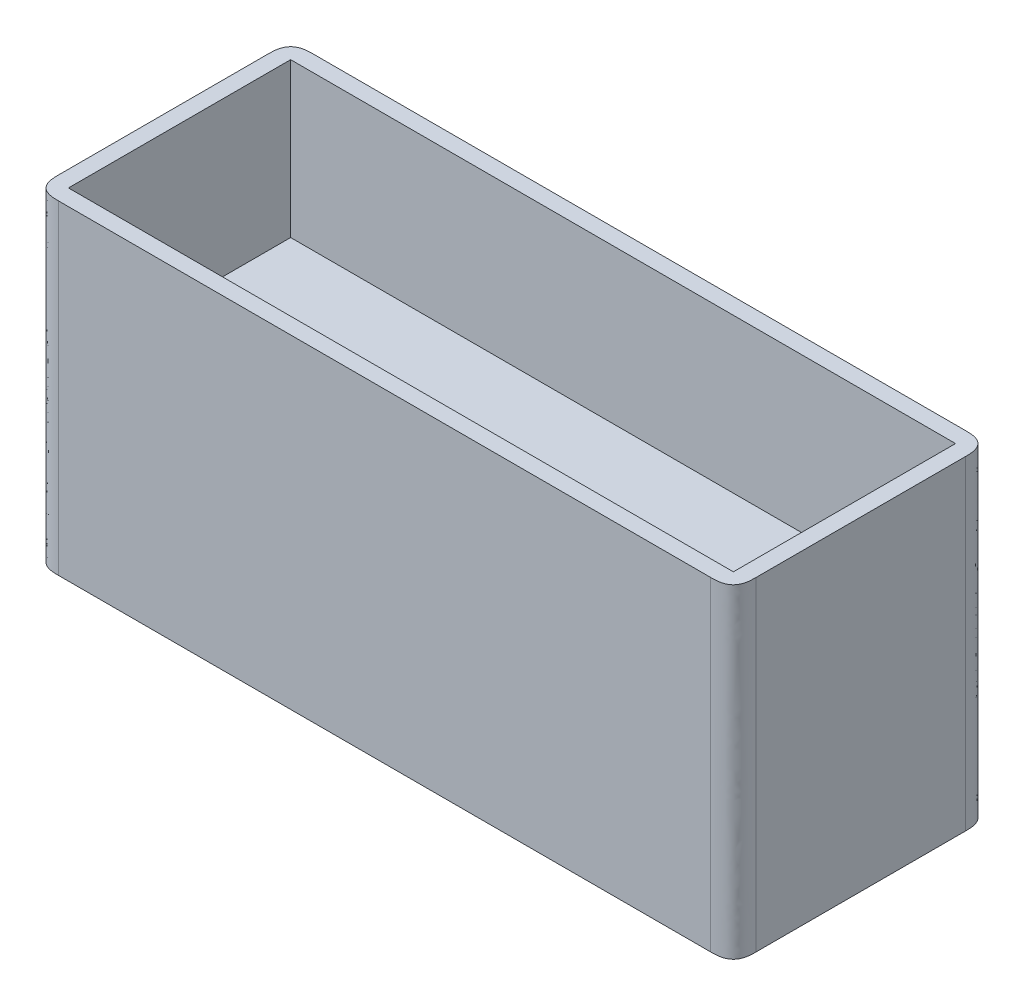
ISO-10303-21;
HEADER;
FILE_DESCRIPTION(('STEP AP214'),'2;1');
FILE_NAME('part.step','',(''),(''),'','','');
FILE_SCHEMA(('AUTOMOTIVE_DESIGN { 1 0 10303 214 1 1 1 1 }'));
ENDSEC;
DATA;
#1=APPLICATION_CONTEXT('core data for automotive mechanical design processes');
#2=APPLICATION_PROTOCOL_DEFINITION('international standard','automotive_design',2000,#1);
#3=PRODUCT_CONTEXT('',#1,'mechanical');
#4=PRODUCT('Part','Part','',(#3));
#5=PRODUCT_RELATED_PRODUCT_CATEGORY('part','',(#4));
#6=PRODUCT_DEFINITION_FORMATION('','',#4);
#7=PRODUCT_DEFINITION_CONTEXT('part definition',#1,'design');
#8=PRODUCT_DEFINITION('design','',#6,#7);
#9=PRODUCT_DEFINITION_SHAPE('','',#8);
#10=(LENGTH_UNIT() NAMED_UNIT(*) SI_UNIT(.MILLI.,.METRE.));
#11=(NAMED_UNIT(*) PLANE_ANGLE_UNIT() SI_UNIT($,.RADIAN.));
#12=(NAMED_UNIT(*) SI_UNIT($,.STERADIAN.) SOLID_ANGLE_UNIT());
#13=UNCERTAINTY_MEASURE_WITH_UNIT(LENGTH_MEASURE(1.E-05),#10,'distance_accuracy_value','');
#14=(GEOMETRIC_REPRESENTATION_CONTEXT(3) GLOBAL_UNCERTAINTY_ASSIGNED_CONTEXT((#13)) GLOBAL_UNIT_ASSIGNED_CONTEXT((#10,
#11,#12)) REPRESENTATION_CONTEXT('',''));
#15=CARTESIAN_POINT('',(0.,0.,0.));
#16=DIRECTION('',(0.,0.,1.));
#17=DIRECTION('',(1.,0.,0.));
#18=AXIS2_PLACEMENT_3D('',#15,#16,#17);
#19=CARTESIAN_POINT('',(102.5,50.,-34.25));
#20=DIRECTION('',(-1.,0.,0.));
#21=DIRECTION('',(0.,0.,1.));
#22=AXIS2_PLACEMENT_3D('',#19,#20,#21);
#23=PLANE('',#22);
#24=DIRECTION('',(0.,-1.,0.));
#25=VECTOR('',#24,1.);
#26=CARTESIAN_POINT('',(102.5,50.,34.25));
#27=LINE('',#26,#25);
#28=CARTESIAN_POINT('',(102.5,-2.5,34.25));
#29=VERTEX_POINT('',#28);
#30=CARTESIAN_POINT('',(102.5,-50.,34.25));
#31=VERTEX_POINT('',#30);
#32=EDGE_CURVE('E169',#29,#31,#27,.T.);
#33=ORIENTED_EDGE('',*,*,#32,.F.);
#34=DIRECTION('',(0.,0.,1.));
#35=VECTOR('',#34,1.);
#36=CARTESIAN_POINT('',(102.5,-2.5,0.));
#37=LINE('',#36,#35);
#38=CARTESIAN_POINT('',(102.5,-2.5,-34.25));
#39=VERTEX_POINT('',#38);
#40=EDGE_CURVE('E193',#39,#29,#37,.T.);
#41=ORIENTED_EDGE('',*,*,#40,.F.);
#42=DIRECTION('',(0.,-1.,0.));
#43=VECTOR('',#42,1.);
#44=CARTESIAN_POINT('',(102.5,50.,-34.25));
#45=LINE('',#44,#43);
#46=CARTESIAN_POINT('',(102.5,-50.,-34.25));
#47=VERTEX_POINT('',#46);
#48=EDGE_CURVE('E224',#39,#47,#45,.T.);
#49=ORIENTED_EDGE('',*,*,#48,.T.);
#50=DIRECTION('',(0.,0.,-1.));
#51=VECTOR('',#50,1.);
#52=CARTESIAN_POINT('',(102.5,-50.,-34.25));
#53=LINE('',#52,#51);
#54=EDGE_CURVE('E185',#31,#47,#53,.T.);
#55=ORIENTED_EDGE('',*,*,#54,.F.);
#56=EDGE_LOOP('',(#33,#41,#49,#55));
#57=FACE_BOUND('',#56,.T.);
#58=ADVANCED_FACE('F37',(#57),#23,.T.);
#59=CARTESIAN_POINT('',(-102.5,50.,-34.25));
#60=DIRECTION('',(0.,0.,1.));
#61=DIRECTION('',(1.,0.,0.));
#62=AXIS2_PLACEMENT_3D('',#59,#60,#61);
#63=PLANE('',#62);
#64=ORIENTED_EDGE('',*,*,#48,.F.);
#65=DIRECTION('',(1.,0.,0.));
#66=VECTOR('',#65,1.);
#67=CARTESIAN_POINT('',(0.,-2.5,-34.25));
#68=LINE('',#67,#66);
#69=CARTESIAN_POINT('',(-102.5,-2.5,-34.25));
#70=VERTEX_POINT('',#69);
#71=EDGE_CURVE('E195',#70,#39,#68,.T.);
#72=ORIENTED_EDGE('',*,*,#71,.F.);
#73=DIRECTION('',(0.,-1.,0.));
#74=VECTOR('',#73,1.);
#75=CARTESIAN_POINT('',(-102.5,50.,-34.25));
#76=LINE('',#75,#74);
#77=CARTESIAN_POINT('',(-102.5,-50.,-34.25));
#78=VERTEX_POINT('',#77);
#79=EDGE_CURVE('E220',#70,#78,#76,.T.);
#80=ORIENTED_EDGE('',*,*,#79,.T.);
#81=DIRECTION('',(-1.,0.,0.));
#82=VECTOR('',#81,1.);
#83=CARTESIAN_POINT('',(-102.5,-50.,-34.25));
#84=LINE('',#83,#82);
#85=EDGE_CURVE('E188',#47,#78,#84,.T.);
#86=ORIENTED_EDGE('',*,*,#85,.F.);
#87=EDGE_LOOP('',(#64,#72,#80,#86));
#88=FACE_BOUND('',#87,.T.);
#89=ADVANCED_FACE('F621',(#88),#63,.T.);
#90=CARTESIAN_POINT('',(-102.5,50.,-34.25));
#91=DIRECTION('',(1.,0.,0.));
#92=DIRECTION('',(0.,0.,-1.));
#93=AXIS2_PLACEMENT_3D('',#90,#91,#92);
#94=PLANE('',#93);
#95=ORIENTED_EDGE('',*,*,#79,.F.);
#96=DIRECTION('',(0.,0.,1.));
#97=VECTOR('',#96,1.);
#98=CARTESIAN_POINT('',(-102.5,-2.5,0.));
#99=LINE('',#98,#97);
#100=CARTESIAN_POINT('',(-102.5,-2.5,34.25));
#101=VERTEX_POINT('',#100);
#102=EDGE_CURVE('E197',#70,#101,#99,.T.);
#103=ORIENTED_EDGE('',*,*,#102,.T.);
#104=DIRECTION('',(0.,-1.,0.));
#105=VECTOR('',#104,1.);
#106=CARTESIAN_POINT('',(-102.5,50.,34.25));
#107=LINE('',#106,#105);
#108=CARTESIAN_POINT('',(-102.5,-50.,34.25));
#109=VERTEX_POINT('',#108);
#110=EDGE_CURVE('E168',#101,#109,#107,.T.);
#111=ORIENTED_EDGE('',*,*,#110,.T.);
#112=DIRECTION('',(0.,0.,1.));
#113=VECTOR('',#112,1.);
#114=CARTESIAN_POINT('',(-102.5,-50.,-34.25));
#115=LINE('',#114,#113);
#116=EDGE_CURVE('E213',#78,#109,#115,.T.);
#117=ORIENTED_EDGE('',*,*,#116,.F.);
#118=EDGE_LOOP('',(#95,#103,#111,#117));
#119=FACE_BOUND('',#118,.T.);
#120=ADVANCED_FACE('F625',(#119),#94,.T.);
#121=CARTESIAN_POINT('',(-102.5,50.,34.25));
#122=DIRECTION('',(0.,0.,-1.));
#123=DIRECTION('',(-1.,0.,0.));
#124=AXIS2_PLACEMENT_3D('',#121,#122,#123);
#125=PLANE('',#124);
#126=ORIENTED_EDGE('',*,*,#110,.F.);
#127=DIRECTION('',(1.,0.,0.));
#128=VECTOR('',#127,1.);
#129=CARTESIAN_POINT('',(0.,-2.5,34.25));
#130=LINE('',#129,#128);
#131=EDGE_CURVE('E180',#101,#29,#130,.T.);
#132=ORIENTED_EDGE('',*,*,#131,.T.);
#133=ORIENTED_EDGE('',*,*,#32,.T.);
#134=DIRECTION('',(1.,0.,0.));
#135=VECTOR('',#134,1.);
#136=CARTESIAN_POINT('',(-102.5,-50.,34.25));
#137=LINE('',#136,#135);
#138=EDGE_CURVE('E205',#109,#31,#137,.T.);
#139=ORIENTED_EDGE('',*,*,#138,.F.);
#140=EDGE_LOOP('',(#126,#132,#133,#139));
#141=FACE_BOUND('',#140,.T.);
#142=ADVANCED_FACE('F628',(#141),#125,.T.);
#143=CARTESIAN_POINT('',(0.,50.,0.));
#144=DIRECTION('',(0.,1.,0.));
#145=DIRECTION('',(0.,0.,1.));
#146=AXIS2_PLACEMENT_3D('',#143,#144,#145);
#147=PLANE('',#146);
#148=DIRECTION('',(-1.,0.,0.));
#149=VECTOR('',#148,1.);
#150=CARTESIAN_POINT('',(-107.5,50.,-39.25));
#151=LINE('',#150,#149);
#152=CARTESIAN_POINT('',(100.5,50.,-39.25));
#153=VERTEX_POINT('',#152);
#154=CARTESIAN_POINT('',(-100.5,50.,-39.25));
#155=VERTEX_POINT('',#154);
#156=EDGE_CURVE('E340',#153,#155,#151,.T.);
#157=ORIENTED_EDGE('',*,*,#156,.T.);
#158=CARTESIAN_POINT('',(-107.5,50.,-32.25));
#159=CARTESIAN_POINT('',(-107.5,50.,-33.4273863607376));
#160=CARTESIAN_POINT('',(-107.5,50.,-34.6047727214753));
#161=CARTESIAN_POINT('',(-106.998156561147,50.,-37.1997474683058));
#162=CARTESIAN_POINT('',(-105.449747468306,50.,-38.7481565611474));
#163=CARTESIAN_POINT('',(-102.854772721475,50.,-39.25));
#164=CARTESIAN_POINT('',(-101.677386360738,50.,-39.25));
#165=CARTESIAN_POINT('',(-100.5,50.,-39.25));
#166=B_SPLINE_CURVE_WITH_KNOTS('',5,(#158,#159,#160,#161,#162,#163,#164,#165),.UNSPECIFIED.,.F.,
.F.,(6,2,6),(0.,0.5,1.),.UNSPECIFIED.);
#167=CARTESIAN_POINT('',(-107.5,50.,-32.25));
#168=VERTEX_POINT('',#167);
#169=EDGE_CURVE('E391',#155,#168,#166,.F.);
#170=ORIENTED_EDGE('',*,*,#169,.T.);
#171=DIRECTION('',(0.,0.,1.));
#172=VECTOR('',#171,1.);
#173=CARTESIAN_POINT('',(-107.5,50.,-39.25));
#174=LINE('',#173,#172);
#175=CARTESIAN_POINT('',(-107.5,50.,32.25));
#176=VERTEX_POINT('',#175);
#177=EDGE_CURVE('E232',#168,#176,#174,.T.);
#178=ORIENTED_EDGE('',*,*,#177,.T.);
#179=CARTESIAN_POINT('',(-100.5,50.,39.25));
#180=CARTESIAN_POINT('',(-101.677386360738,50.,39.25));
#181=CARTESIAN_POINT('',(-102.854772721475,50.,39.25));
#182=CARTESIAN_POINT('',(-105.449747468306,50.,38.7481565611474));
#183=CARTESIAN_POINT('',(-106.998156561147,50.,37.1997474683058));
#184=CARTESIAN_POINT('',(-107.5,50.,34.6047727214753));
#185=CARTESIAN_POINT('',(-107.5,50.,33.4273863607376));
#186=CARTESIAN_POINT('',(-107.5,50.,32.25));
#187=B_SPLINE_CURVE_WITH_KNOTS('',5,(#179,#180,#181,#182,#183,#184,#185,#186),.UNSPECIFIED.,.F.,
.F.,(6,2,6),(0.,0.5,1.),.UNSPECIFIED.);
#188=CARTESIAN_POINT('',(-100.5,50.,39.25));
#189=VERTEX_POINT('',#188);
#190=EDGE_CURVE('E379',#176,#189,#187,.F.);
#191=ORIENTED_EDGE('',*,*,#190,.T.);
#192=DIRECTION('',(1.,0.,0.));
#193=VECTOR('',#192,1.);
#194=CARTESIAN_POINT('',(-107.5,50.,39.25));
#195=LINE('',#194,#193);
#196=CARTESIAN_POINT('',(100.5,50.,39.25));
#197=VERTEX_POINT('',#196);
#198=EDGE_CURVE('E236',#189,#197,#195,.T.);
#199=ORIENTED_EDGE('',*,*,#198,.T.);
#200=CARTESIAN_POINT('',(107.5,50.,32.25));
#201=CARTESIAN_POINT('',(107.5,50.,33.4273863607376));
#202=CARTESIAN_POINT('',(107.5,50.,34.6047727214753));
#203=CARTESIAN_POINT('',(106.998156561147,50.,37.1997474683058));
#204=CARTESIAN_POINT('',(105.449747468306,50.,38.7481565611474));
#205=CARTESIAN_POINT('',(102.854772721475,50.,39.25));
#206=CARTESIAN_POINT('',(101.677386360738,50.,39.25));
#207=CARTESIAN_POINT('',(100.5,50.,39.25));
#208=B_SPLINE_CURVE_WITH_KNOTS('',5,(#200,#201,#202,#203,#204,#205,#206,#207),.UNSPECIFIED.,.F.,
.F.,(6,2,6),(0.,0.5,1.),.UNSPECIFIED.);
#209=CARTESIAN_POINT('',(107.5,50.,32.25));
#210=VERTEX_POINT('',#209);
#211=EDGE_CURVE('E65',#197,#210,#208,.F.);
#212=ORIENTED_EDGE('',*,*,#211,.T.);
#213=DIRECTION('',(0.,0.,-1.));
#214=VECTOR('',#213,1.);
#215=CARTESIAN_POINT('',(107.5,50.,-39.25));
#216=LINE('',#215,#214);
#217=CARTESIAN_POINT('',(107.5,50.,-32.25));
#218=VERTEX_POINT('',#217);
#219=EDGE_CURVE('E348',#210,#218,#216,.T.);
#220=ORIENTED_EDGE('',*,*,#219,.T.);
#221=CARTESIAN_POINT('',(100.5,49.9999999999817,-39.25));
#222=CARTESIAN_POINT('',(101.677386360738,49.9999999999817,-39.25));
#223=CARTESIAN_POINT('',(102.854772721475,49.9999999999817,-39.25));
#224=CARTESIAN_POINT('',(105.449747468306,50.0000000000291,-38.7481565611474));
#225=CARTESIAN_POINT('',(106.998156561147,50.0000000000291,-37.1997474683058));
#226=CARTESIAN_POINT('',(107.5,49.9999999999817,-34.6047727214752));
#227=CARTESIAN_POINT('',(107.5,49.9999999999817,-33.4273863607376));
#228=CARTESIAN_POINT('',(107.5,49.9999999999817,-32.25));
#229=B_SPLINE_CURVE_WITH_KNOTS('',5,(#221,#222,#223,#224,#225,#226,#227,#228),.UNSPECIFIED.,.F.,
.F.,(6,2,6),(0.,0.5,1.),.UNSPECIFIED.);
#230=EDGE_CURVE('E359',#218,#153,#229,.F.);
#231=ORIENTED_EDGE('',*,*,#230,.T.);
#232=EDGE_LOOP('',(#157,#170,#178,#191,#199,#212,#220,#231));
#233=FACE_BOUND('',#232,.T.);
#234=DIRECTION('',(-1.,0.,0.));
#235=VECTOR('',#234,1.);
#236=CARTESIAN_POINT('',(-102.5,50.,-34.25));
#237=LINE('',#236,#235);
#238=CARTESIAN_POINT('',(102.5,50.,-34.25));
#239=VERTEX_POINT('',#238);
#240=CARTESIAN_POINT('',(-102.5,50.,-34.25));
#241=VERTEX_POINT('',#240);
#242=EDGE_CURVE('E204',#239,#241,#237,.T.);
#243=ORIENTED_EDGE('',*,*,#242,.F.);
#244=DIRECTION('',(0.,0.,-1.));
#245=VECTOR('',#244,1.);
#246=CARTESIAN_POINT('',(102.5,50.,-34.25));
#247=LINE('',#246,#245);
#248=CARTESIAN_POINT('',(102.5,50.,34.25));
#249=VERTEX_POINT('',#248);
#250=EDGE_CURVE('E202',#249,#239,#247,.T.);
#251=ORIENTED_EDGE('',*,*,#250,.F.);
#252=DIRECTION('',(1.,0.,0.));
#253=VECTOR('',#252,1.);
#254=CARTESIAN_POINT('',(-102.5,50.,34.25));
#255=LINE('',#254,#253);
#256=CARTESIAN_POINT('',(-102.5,50.,34.25));
#257=VERTEX_POINT('',#256);
#258=EDGE_CURVE('E165',#257,#249,#255,.T.);
#259=ORIENTED_EDGE('',*,*,#258,.F.);
#260=DIRECTION('',(0.,0.,1.));
#261=VECTOR('',#260,1.);
#262=CARTESIAN_POINT('',(-102.5,50.,-34.25));
#263=LINE('',#262,#261);
#264=EDGE_CURVE('E207',#241,#257,#263,.T.);
#265=ORIENTED_EDGE('',*,*,#264,.F.);
#266=EDGE_LOOP('',(#243,#251,#259,#265));
#267=FACE_BOUND('',#266,.T.);
#268=ADVANCED_FACE('F314',(#233,#267),#147,.T.);
#269=CARTESIAN_POINT('',(0.,-50.,0.));
#270=DIRECTION('',(0.,1.,0.));
#271=DIRECTION('',(0.,0.,1.));
#272=AXIS2_PLACEMENT_3D('',#269,#270,#271);
#273=PLANE('',#272);
#274=DIRECTION('',(0.,0.,1.));
#275=VECTOR('',#274,1.);
#276=CARTESIAN_POINT('',(-107.5,-50.,-39.25));
#277=LINE('',#276,#275);
#278=CARTESIAN_POINT('',(-107.5,-50.,-32.25));
#279=VERTEX_POINT('',#278);
#280=CARTESIAN_POINT('',(-107.5,-50.,32.25));
#281=VERTEX_POINT('',#280);
#282=EDGE_CURVE('E226',#279,#281,#277,.T.);
#283=ORIENTED_EDGE('',*,*,#282,.F.);
#284=CARTESIAN_POINT('',(-100.5,-50.,-39.25));
#285=CARTESIAN_POINT('',(-101.677386360738,-50.,-39.25));
#286=CARTESIAN_POINT('',(-102.854772721475,-50.,-39.25));
#287=CARTESIAN_POINT('',(-105.449747468306,-50.,-38.7481565611474));
#288=CARTESIAN_POINT('',(-106.998156561147,-50.,-37.1997474683058));
#289=CARTESIAN_POINT('',(-107.5,-50.,-34.6047727214753));
#290=CARTESIAN_POINT('',(-107.5,-50.,-33.4273863607376));
#291=CARTESIAN_POINT('',(-107.5,-50.,-32.25));
#292=B_SPLINE_CURVE_WITH_KNOTS('',5,(#284,#285,#286,#287,#288,#289,#290,#291),.UNSPECIFIED.,.F.,
.F.,(6,2,6),(0.,0.5,1.),.UNSPECIFIED.);
#293=CARTESIAN_POINT('',(-100.5,-50.,-39.25));
#294=VERTEX_POINT('',#293);
#295=EDGE_CURVE('E336',#279,#294,#292,.F.);
#296=ORIENTED_EDGE('',*,*,#295,.T.);
#297=DIRECTION('',(-1.,0.,0.));
#298=VECTOR('',#297,1.);
#299=CARTESIAN_POINT('',(-107.5,-50.,-39.25));
#300=LINE('',#299,#298);
#301=CARTESIAN_POINT('',(100.5,-50.,-39.25));
#302=VERTEX_POINT('',#301);
#303=EDGE_CURVE('E237',#302,#294,#300,.T.);
#304=ORIENTED_EDGE('',*,*,#303,.F.);
#305=CARTESIAN_POINT('',(107.5,-50.0000000000009,-32.25));
#306=CARTESIAN_POINT('',(107.5,-50.0000000000009,-33.4273863607376));
#307=CARTESIAN_POINT('',(107.5,-50.0000000000009,-34.6047727214753));
#308=CARTESIAN_POINT('',(106.998156561147,-49.9999999999986,-37.1997474683058));
#309=CARTESIAN_POINT('',(105.449747468306,-49.9999999999986,-38.7481565611474));
#310=CARTESIAN_POINT('',(102.854772721475,-50.0000000000009,-39.25));
#311=CARTESIAN_POINT('',(101.677386360738,-50.0000000000009,-39.25));
#312=CARTESIAN_POINT('',(100.5,-50.0000000000009,-39.25));
#313=B_SPLINE_CURVE_WITH_KNOTS('',5,(#305,#306,#307,#308,#309,#310,#311,#312),.UNSPECIFIED.,.F.,
.F.,(6,2,6),(0.,0.5,1.),.UNSPECIFIED.);
#314=CARTESIAN_POINT('',(107.5,-50.,-32.25));
#315=VERTEX_POINT('',#314);
#316=EDGE_CURVE('E299',#302,#315,#313,.F.);
#317=ORIENTED_EDGE('',*,*,#316,.T.);
#318=DIRECTION('',(0.,0.,-1.));
#319=VECTOR('',#318,1.);
#320=CARTESIAN_POINT('',(107.5,-50.,-39.25));
#321=LINE('',#320,#319);
#322=CARTESIAN_POINT('',(107.5,-50.,32.25));
#323=VERTEX_POINT('',#322);
#324=EDGE_CURVE('E283',#323,#315,#321,.T.);
#325=ORIENTED_EDGE('',*,*,#324,.F.);
#326=CARTESIAN_POINT('',(100.5,-50.,39.25));
#327=CARTESIAN_POINT('',(101.677386360738,-50.,39.25));
#328=CARTESIAN_POINT('',(102.854772721475,-50.,39.25));
#329=CARTESIAN_POINT('',(105.449747468306,-50.,38.7481565611474));
#330=CARTESIAN_POINT('',(106.998156561147,-50.,37.1997474683058));
#331=CARTESIAN_POINT('',(107.5,-50.,34.6047727214753));
#332=CARTESIAN_POINT('',(107.5,-50.,33.4273863607376));
#333=CARTESIAN_POINT('',(107.5,-50.,32.25));
#334=B_SPLINE_CURVE_WITH_KNOTS('',5,(#326,#327,#328,#329,#330,#331,#332,#333),.UNSPECIFIED.,.F.,
.F.,(6,2,6),(0.,0.5,1.),.UNSPECIFIED.);
#335=CARTESIAN_POINT('',(100.5,-50.,39.25));
#336=VERTEX_POINT('',#335);
#337=EDGE_CURVE('E544',#323,#336,#334,.F.);
#338=ORIENTED_EDGE('',*,*,#337,.T.);
#339=DIRECTION('',(1.,0.,0.));
#340=VECTOR('',#339,1.);
#341=CARTESIAN_POINT('',(-107.5,-50.,39.25));
#342=LINE('',#341,#340);
#343=CARTESIAN_POINT('',(-100.5,-50.,39.25));
#344=VERTEX_POINT('',#343);
#345=EDGE_CURVE('E292',#344,#336,#342,.T.);
#346=ORIENTED_EDGE('',*,*,#345,.F.);
#347=CARTESIAN_POINT('',(-107.5,-50.,32.25));
#348=CARTESIAN_POINT('',(-107.5,-50.,33.4273863607376));
#349=CARTESIAN_POINT('',(-107.5,-50.,34.6047727214753));
#350=CARTESIAN_POINT('',(-106.998156561147,-50.,37.1997474683058));
#351=CARTESIAN_POINT('',(-105.449747468306,-50.,38.7481565611474));
#352=CARTESIAN_POINT('',(-102.854772721475,-50.,39.25));
#353=CARTESIAN_POINT('',(-101.677386360738,-50.,39.25));
#354=CARTESIAN_POINT('',(-100.5,-50.,39.25));
#355=B_SPLINE_CURVE_WITH_KNOTS('',5,(#347,#348,#349,#350,#351,#352,#353,#354),.UNSPECIFIED.,.F.,
.F.,(6,2,6),(0.,0.5,1.),.UNSPECIFIED.);
#356=EDGE_CURVE('E489',#344,#281,#355,.F.);
#357=ORIENTED_EDGE('',*,*,#356,.T.);
#358=EDGE_LOOP('',(#283,#296,#304,#317,#325,#338,#346,#357));
#359=FACE_BOUND('',#358,.T.);
#360=ORIENTED_EDGE('',*,*,#54,.T.);
#361=ORIENTED_EDGE('',*,*,#85,.T.);
#362=ORIENTED_EDGE('',*,*,#116,.T.);
#363=ORIENTED_EDGE('',*,*,#138,.T.);
#364=EDGE_LOOP('',(#360,#361,#362,#363));
#365=FACE_BOUND('',#364,.T.);
#366=ADVANCED_FACE('F263',(#359,#365),#273,.F.);
#367=CARTESIAN_POINT('',(-107.5,50.,-39.25));
#368=DIRECTION('',(1.,0.,0.));
#369=DIRECTION('',(0.,0.,-1.));
#370=AXIS2_PLACEMENT_3D('',#367,#368,#369);
#371=PLANE('',#370);
#372=ORIENTED_EDGE('',*,*,#177,.F.);
#373=CARTESIAN_POINT('',(-107.5,-55.,-32.25));
#374=CARTESIAN_POINT('',(-107.5,-18.3333333333333,-32.25));
#375=CARTESIAN_POINT('',(-107.5,18.3333333333015,-32.25));
#376=CARTESIAN_POINT('',(-107.5,55.,-32.25));
#377=B_SPLINE_CURVE_WITH_KNOTS('',3,(#373,#374,#375,#376),.UNSPECIFIED.,.F.,.F.,(4,4),(-0.005,
0.105),.UNSPECIFIED.);
#378=EDGE_CURVE('E459',#168,#279,#377,.F.);
#379=ORIENTED_EDGE('',*,*,#378,.T.);
#380=ORIENTED_EDGE('',*,*,#282,.T.);
#381=CARTESIAN_POINT('',(-107.5,55.,32.25));
#382=CARTESIAN_POINT('',(-107.5,18.3333333333015,32.25));
#383=CARTESIAN_POINT('',(-107.5,-18.3333333333333,32.25));
#384=CARTESIAN_POINT('',(-107.5,-55.,32.25));
#385=B_SPLINE_CURVE_WITH_KNOTS('',3,(#381,#382,#383,#384),.UNSPECIFIED.,.F.,.F.,(4,4),(-0.005,
0.105),.UNSPECIFIED.);
#386=EDGE_CURVE('E245',#281,#176,#385,.F.);
#387=ORIENTED_EDGE('',*,*,#386,.T.);
#388=EDGE_LOOP('',(#372,#379,#380,#387));
#389=FACE_BOUND('',#388,.T.);
#390=ADVANCED_FACE('F252',(#389),#371,.F.);
#391=CARTESIAN_POINT('',(-107.5,50.,39.25));
#392=DIRECTION('',(0.,0.,-1.));
#393=DIRECTION('',(-1.,0.,0.));
#394=AXIS2_PLACEMENT_3D('',#391,#392,#393);
#395=PLANE('',#394);
#396=ORIENTED_EDGE('',*,*,#198,.F.);
#397=CARTESIAN_POINT('',(-100.5,-55.,39.25));
#398=CARTESIAN_POINT('',(-100.5,-18.3333333333333,39.25));
#399=CARTESIAN_POINT('',(-100.5,18.3333333333015,39.25));
#400=CARTESIAN_POINT('',(-100.5,55.,39.25));
#401=B_SPLINE_CURVE_WITH_KNOTS('',3,(#397,#398,#399,#400),.UNSPECIFIED.,.F.,.F.,(4,4),(-0.005,
0.105),.UNSPECIFIED.);
#402=EDGE_CURVE('E415',#189,#344,#401,.F.);
#403=ORIENTED_EDGE('',*,*,#402,.T.);
#404=ORIENTED_EDGE('',*,*,#345,.T.);
#405=CARTESIAN_POINT('',(100.5,55.,39.25));
#406=CARTESIAN_POINT('',(100.5,18.3333333333015,39.25));
#407=CARTESIAN_POINT('',(100.5,-18.3333333333333,39.25));
#408=CARTESIAN_POINT('',(100.5,-55.,39.25));
#409=B_SPLINE_CURVE_WITH_KNOTS('',3,(#405,#406,#407,#408),.UNSPECIFIED.,.F.,.F.,(4,4),(-0.005,
0.105),.UNSPECIFIED.);
#410=EDGE_CURVE('E403',#336,#197,#409,.F.);
#411=ORIENTED_EDGE('',*,*,#410,.T.);
#412=EDGE_LOOP('',(#396,#403,#404,#411));
#413=FACE_BOUND('',#412,.T.);
#414=ADVANCED_FACE('F262',(#413),#395,.F.);
#415=CARTESIAN_POINT('',(107.5,50.,-39.25));
#416=DIRECTION('',(-1.,0.,0.));
#417=DIRECTION('',(0.,0.,1.));
#418=AXIS2_PLACEMENT_3D('',#415,#416,#417);
#419=PLANE('',#418);
#420=ORIENTED_EDGE('',*,*,#219,.F.);
#421=CARTESIAN_POINT('',(107.5,-55.,32.25));
#422=CARTESIAN_POINT('',(107.5,-18.3333333333333,32.25));
#423=CARTESIAN_POINT('',(107.5,18.3333333333015,32.25));
#424=CARTESIAN_POINT('',(107.5,55.,32.25));
#425=B_SPLINE_CURVE_WITH_KNOTS('',3,(#421,#422,#423,#424),.UNSPECIFIED.,.F.,.F.,(4,4),(-0.005,
0.105),.UNSPECIFIED.);
#426=EDGE_CURVE('E11',#210,#323,#425,.F.);
#427=ORIENTED_EDGE('',*,*,#426,.T.);
#428=ORIENTED_EDGE('',*,*,#324,.T.);
#429=CARTESIAN_POINT('',(107.5,55.,-32.25));
#430=CARTESIAN_POINT('',(107.5,18.3333333333015,-32.25));
#431=CARTESIAN_POINT('',(107.5,-18.3333333333333,-32.25));
#432=CARTESIAN_POINT('',(107.5,-55.,-32.25));
#433=B_SPLINE_CURVE_WITH_KNOTS('',3,(#429,#430,#431,#432),.UNSPECIFIED.,.F.,.F.,(4,4),(-0.005,
0.105),.UNSPECIFIED.);
#434=EDGE_CURVE('E51',#315,#218,#433,.F.);
#435=ORIENTED_EDGE('',*,*,#434,.T.);
#436=EDGE_LOOP('',(#420,#427,#428,#435));
#437=FACE_BOUND('',#436,.T.);
#438=ADVANCED_FACE('F429',(#437),#419,.F.);
#439=CARTESIAN_POINT('',(-107.5,50.,-39.25));
#440=DIRECTION('',(0.,0.,1.));
#441=DIRECTION('',(1.,0.,0.));
#442=AXIS2_PLACEMENT_3D('',#439,#440,#441);
#443=PLANE('',#442);
#444=ORIENTED_EDGE('',*,*,#303,.T.);
#445=CARTESIAN_POINT('',(-100.5,55.,-39.25));
#446=CARTESIAN_POINT('',(-100.5,18.3333333333015,-39.25));
#447=CARTESIAN_POINT('',(-100.5,-18.3333333333333,-39.25));
#448=CARTESIAN_POINT('',(-100.5,-55.,-39.25));
#449=B_SPLINE_CURVE_WITH_KNOTS('',3,(#445,#446,#447,#448),.UNSPECIFIED.,.F.,.F.,(4,4),(-0.005,
0.105),.UNSPECIFIED.);
#450=EDGE_CURVE('E478',#294,#155,#449,.F.);
#451=ORIENTED_EDGE('',*,*,#450,.T.);
#452=ORIENTED_EDGE('',*,*,#156,.F.);
#453=CARTESIAN_POINT('',(100.5,-55.,-39.25));
#454=CARTESIAN_POINT('',(100.5,-18.3333333333333,-39.25));
#455=CARTESIAN_POINT('',(100.5,18.3333333333015,-39.25));
#456=CARTESIAN_POINT('',(100.5,55.,-39.25));
#457=B_SPLINE_CURVE_WITH_KNOTS('',3,(#453,#454,#455,#456),.UNSPECIFIED.,.F.,.F.,(4,4),(-0.005,
0.105),.UNSPECIFIED.);
#458=EDGE_CURVE('E592',#153,#302,#457,.F.);
#459=ORIENTED_EDGE('',*,*,#458,.T.);
#460=EDGE_LOOP('',(#444,#451,#452,#459));
#461=FACE_BOUND('',#460,.T.);
#462=ADVANCED_FACE('F317',(#461),#443,.F.);
#463=DIRECTION('',(0.,0.,1.));
#464=VECTOR('',#463,1.);
#465=CARTESIAN_POINT('',(102.5,2.5,0.));
#466=LINE('',#465,#464);
#467=CARTESIAN_POINT('',(102.5,2.5,-34.25));
#468=VERTEX_POINT('',#467);
#469=CARTESIAN_POINT('',(102.5,2.5,34.25));
#470=VERTEX_POINT('',#469);
#471=EDGE_CURVE('E173',#468,#470,#466,.T.);
#472=ORIENTED_EDGE('',*,*,#471,.T.);
#473=EDGE_CURVE('E158',#249,#470,#27,.T.);
#474=ORIENTED_EDGE('',*,*,#473,.F.);
#475=ORIENTED_EDGE('',*,*,#250,.T.);
#476=EDGE_CURVE('E176',#239,#468,#45,.T.);
#477=ORIENTED_EDGE('',*,*,#476,.T.);
#478=EDGE_LOOP('',(#472,#474,#475,#477));
#479=FACE_BOUND('',#478,.T.);
#480=ADVANCED_FACE('F174',(#479),#23,.T.);
#481=DIRECTION('',(1.,0.,0.));
#482=VECTOR('',#481,1.);
#483=CARTESIAN_POINT('',(0.,2.5,-34.25));
#484=LINE('',#483,#482);
#485=CARTESIAN_POINT('',(-102.5,2.5,-34.25));
#486=VERTEX_POINT('',#485);
#487=EDGE_CURVE('E179',#486,#468,#484,.T.);
#488=ORIENTED_EDGE('',*,*,#487,.T.);
#489=ORIENTED_EDGE('',*,*,#476,.F.);
#490=ORIENTED_EDGE('',*,*,#242,.T.);
#491=EDGE_CURVE('E221',#241,#486,#76,.T.);
#492=ORIENTED_EDGE('',*,*,#491,.T.);
#493=EDGE_LOOP('',(#488,#489,#490,#492));
#494=FACE_BOUND('',#493,.T.);
#495=ADVANCED_FACE('F645',(#494),#63,.T.);
#496=DIRECTION('',(0.,0.,1.));
#497=VECTOR('',#496,1.);
#498=CARTESIAN_POINT('',(-102.5,2.5,0.));
#499=LINE('',#498,#497);
#500=CARTESIAN_POINT('',(-102.5,2.5,34.25));
#501=VERTEX_POINT('',#500);
#502=EDGE_CURVE('E184',#486,#501,#499,.T.);
#503=ORIENTED_EDGE('',*,*,#502,.F.);
#504=ORIENTED_EDGE('',*,*,#491,.F.);
#505=ORIENTED_EDGE('',*,*,#264,.T.);
#506=EDGE_CURVE('E218',#257,#501,#107,.T.);
#507=ORIENTED_EDGE('',*,*,#506,.T.);
#508=EDGE_LOOP('',(#503,#504,#505,#507));
#509=FACE_BOUND('',#508,.T.);
#510=ADVANCED_FACE('F638',(#509),#94,.T.);
#511=DIRECTION('',(1.,0.,0.));
#512=VECTOR('',#511,1.);
#513=CARTESIAN_POINT('',(0.,2.5,34.25));
#514=LINE('',#513,#512);
#515=EDGE_CURVE('E162',#501,#470,#514,.T.);
#516=ORIENTED_EDGE('',*,*,#515,.F.);
#517=ORIENTED_EDGE('',*,*,#506,.F.);
#518=ORIENTED_EDGE('',*,*,#258,.T.);
#519=ORIENTED_EDGE('',*,*,#473,.T.);
#520=EDGE_LOOP('',(#516,#517,#518,#519));
#521=FACE_BOUND('',#520,.T.);
#522=ADVANCED_FACE('F160',(#521),#125,.T.);
#523=CARTESIAN_POINT('',(0.,-2.5,0.));
#524=DIRECTION('',(0.,1.,0.));
#525=DIRECTION('',(0.,0.,1.));
#526=AXIS2_PLACEMENT_3D('',#523,#524,#525);
#527=PLANE('',#526);
#528=ORIENTED_EDGE('',*,*,#40,.T.);
#529=ORIENTED_EDGE('',*,*,#131,.F.);
#530=ORIENTED_EDGE('',*,*,#102,.F.);
#531=ORIENTED_EDGE('',*,*,#71,.T.);
#532=EDGE_LOOP('',(#528,#529,#530,#531));
#533=FACE_BOUND('',#532,.T.);
#534=ADVANCED_FACE('F630',(#533),#527,.F.);
#535=CARTESIAN_POINT('',(0.,2.5,0.));
#536=DIRECTION('',(0.,1.,0.));
#537=DIRECTION('',(0.,0.,1.));
#538=AXIS2_PLACEMENT_3D('',#535,#536,#537);
#539=PLANE('',#538);
#540=ORIENTED_EDGE('',*,*,#471,.F.);
#541=ORIENTED_EDGE('',*,*,#487,.F.);
#542=ORIENTED_EDGE('',*,*,#502,.T.);
#543=ORIENTED_EDGE('',*,*,#515,.T.);
#544=EDGE_LOOP('',(#540,#541,#542,#543));
#545=FACE_BOUND('',#544,.T.);
#546=ADVANCED_FACE('F183',(#545),#539,.T.);
#547=CARTESIAN_POINT('',(-107.5,55.,-32.25));
#548=CARTESIAN_POINT('',(-107.5,18.3333333333015,-32.25));
#549=CARTESIAN_POINT('',(-107.5,-18.3333333333333,-32.25));
#550=CARTESIAN_POINT('',(-107.5,-55.,-32.25));
#551=CARTESIAN_POINT('',(-107.5,55.,-33.4273863607376));
#552=CARTESIAN_POINT('',(-107.5,18.3333333333015,-33.4273863607376));
#553=CARTESIAN_POINT('',(-107.5,-18.3333333333333,-33.4273863607376));
#554=CARTESIAN_POINT('',(-107.5,-55.,-33.4273863607376));
#555=CARTESIAN_POINT('',(-107.5,55.,-34.6047727214753));
#556=CARTESIAN_POINT('',(-107.5,18.3333333333015,-34.6047727214753));
#557=CARTESIAN_POINT('',(-107.5,-18.3333333333333,-34.6047727214753));
#558=CARTESIAN_POINT('',(-107.5,-55.,-34.6047727214753));
#559=CARTESIAN_POINT('',(-106.998156561147,55.,-37.1997474683058));
#560=CARTESIAN_POINT('',(-106.998156561147,18.3333333333015,-37.1997474683058));
#561=CARTESIAN_POINT('',(-106.998156561147,-18.3333333333333,-37.1997474683058));
#562=CARTESIAN_POINT('',(-106.998156561147,-55.,-37.1997474683058));
#563=CARTESIAN_POINT('',(-105.449747468306,55.,-38.7481565611474));
#564=CARTESIAN_POINT('',(-105.449747468306,18.3333333333015,-38.7481565611474));
#565=CARTESIAN_POINT('',(-105.449747468306,-18.3333333333333,-38.7481565611474));
#566=CARTESIAN_POINT('',(-105.449747468306,-55.,-38.7481565611474));
#567=CARTESIAN_POINT('',(-102.854772721475,55.,-39.25));
#568=CARTESIAN_POINT('',(-102.854772721475,18.3333333333015,-39.25));
#569=CARTESIAN_POINT('',(-102.854772721475,-18.3333333333333,-39.25));
#570=CARTESIAN_POINT('',(-102.854772721475,-55.,-39.25));
#571=CARTESIAN_POINT('',(-101.677386360738,55.,-39.25));
#572=CARTESIAN_POINT('',(-101.677386360738,18.3333333333015,-39.25));
#573=CARTESIAN_POINT('',(-101.677386360738,-18.3333333333333,-39.25));
#574=CARTESIAN_POINT('',(-101.677386360738,-55.,-39.25));
#575=CARTESIAN_POINT('',(-100.5,55.,-39.25));
#576=CARTESIAN_POINT('',(-100.5,18.3333333333015,-39.25));
#577=CARTESIAN_POINT('',(-100.5,-18.3333333333333,-39.25));
#578=CARTESIAN_POINT('',(-100.5,-55.,-39.25));
#579=B_SPLINE_SURFACE_WITH_KNOTS('',5,3,((#547,#548,#549,#550),(#551,#552,#553,#554),(#555,#556,
#557,#558),(#559,#560,#561,#562),(#563,#564,#565,#566),(#567,#568,#569,#570),(#571,#572,#573,
#574),(#575,#576,#577,#578)),.UNSPECIFIED.,.F.,.F.,.F.,(6,2,6),(4,4),(0.,0.5,1.),(-0.005,0.105),.UNSPECIFIED.);
#580=ORIENTED_EDGE('',*,*,#169,.F.);
#581=ORIENTED_EDGE('',*,*,#450,.F.);
#582=ORIENTED_EDGE('',*,*,#295,.F.);
#583=ORIENTED_EDGE('',*,*,#378,.F.);
#584=EDGE_LOOP('',(#580,#581,#582,#583));
#585=FACE_BOUND('',#584,.T.);
#586=ADVANCED_FACE('F267',(#585),#579,.T.);
#587=CARTESIAN_POINT('',(-100.5,55.,39.25));
#588=CARTESIAN_POINT('',(-100.5,18.3333333333015,39.25));
#589=CARTESIAN_POINT('',(-100.5,-18.3333333333333,39.25));
#590=CARTESIAN_POINT('',(-100.5,-55.,39.25));
#591=CARTESIAN_POINT('',(-101.677386360738,55.,39.25));
#592=CARTESIAN_POINT('',(-101.677386360738,18.3333333333015,39.25));
#593=CARTESIAN_POINT('',(-101.677386360738,-18.3333333333333,39.25));
#594=CARTESIAN_POINT('',(-101.677386360738,-55.,39.25));
#595=CARTESIAN_POINT('',(-102.854772721475,55.,39.25));
#596=CARTESIAN_POINT('',(-102.854772721475,18.3333333333015,39.25));
#597=CARTESIAN_POINT('',(-102.854772721475,-18.3333333333333,39.25));
#598=CARTESIAN_POINT('',(-102.854772721475,-55.,39.25));
#599=CARTESIAN_POINT('',(-105.449747468306,55.,38.7481565611474));
#600=CARTESIAN_POINT('',(-105.449747468306,18.3333333333015,38.7481565611474));
#601=CARTESIAN_POINT('',(-105.449747468306,-18.3333333333333,38.7481565611474));
#602=CARTESIAN_POINT('',(-105.449747468306,-55.,38.7481565611474));
#603=CARTESIAN_POINT('',(-106.998156561147,55.,37.1997474683058));
#604=CARTESIAN_POINT('',(-106.998156561147,18.3333333333015,37.1997474683058));
#605=CARTESIAN_POINT('',(-106.998156561147,-18.3333333333333,37.1997474683058));
#606=CARTESIAN_POINT('',(-106.998156561147,-55.,37.1997474683058));
#607=CARTESIAN_POINT('',(-107.5,55.,34.6047727214753));
#608=CARTESIAN_POINT('',(-107.5,18.3333333333015,34.6047727214753));
#609=CARTESIAN_POINT('',(-107.5,-18.3333333333333,34.6047727214753));
#610=CARTESIAN_POINT('',(-107.5,-55.,34.6047727214753));
#611=CARTESIAN_POINT('',(-107.5,55.,33.4273863607376));
#612=CARTESIAN_POINT('',(-107.5,18.3333333333015,33.4273863607376));
#613=CARTESIAN_POINT('',(-107.5,-18.3333333333333,33.4273863607376));
#614=CARTESIAN_POINT('',(-107.5,-55.,33.4273863607376));
#615=CARTESIAN_POINT('',(-107.5,55.,32.25));
#616=CARTESIAN_POINT('',(-107.5,18.3333333333015,32.25));
#617=CARTESIAN_POINT('',(-107.5,-18.3333333333333,32.25));
#618=CARTESIAN_POINT('',(-107.5,-55.,32.25));
#619=B_SPLINE_SURFACE_WITH_KNOTS('',5,3,((#587,#588,#589,#590),(#591,#592,#593,#594),(#595,#596,
#597,#598),(#599,#600,#601,#602),(#603,#604,#605,#606),(#607,#608,#609,#610),(#611,#612,#613,
#614),(#615,#616,#617,#618)),.UNSPECIFIED.,.F.,.F.,.F.,(6,2,6),(4,4),(0.,0.5,1.),(-0.005,0.105),.UNSPECIFIED.);
#620=ORIENTED_EDGE('',*,*,#190,.F.);
#621=ORIENTED_EDGE('',*,*,#386,.F.);
#622=ORIENTED_EDGE('',*,*,#356,.F.);
#623=ORIENTED_EDGE('',*,*,#402,.F.);
#624=EDGE_LOOP('',(#620,#621,#622,#623));
#625=FACE_BOUND('',#624,.T.);
#626=ADVANCED_FACE('F495',(#625),#619,.T.);
#627=CARTESIAN_POINT('',(107.5,55.,32.25));
#628=CARTESIAN_POINT('',(107.5,18.3333333333015,32.25));
#629=CARTESIAN_POINT('',(107.5,-18.3333333333333,32.25));
#630=CARTESIAN_POINT('',(107.5,-55.,32.25));
#631=CARTESIAN_POINT('',(107.5,55.,33.4273863607376));
#632=CARTESIAN_POINT('',(107.5,18.3333333333015,33.4273863607376));
#633=CARTESIAN_POINT('',(107.5,-18.3333333333333,33.4273863607376));
#634=CARTESIAN_POINT('',(107.5,-55.,33.4273863607376));
#635=CARTESIAN_POINT('',(107.5,55.,34.6047727214753));
#636=CARTESIAN_POINT('',(107.5,18.3333333333015,34.6047727214753));
#637=CARTESIAN_POINT('',(107.5,-18.3333333333333,34.6047727214753));
#638=CARTESIAN_POINT('',(107.5,-55.,34.6047727214753));
#639=CARTESIAN_POINT('',(106.998156561147,55.,37.1997474683058));
#640=CARTESIAN_POINT('',(106.998156561147,18.3333333333015,37.1997474683058));
#641=CARTESIAN_POINT('',(106.998156561147,-18.3333333333333,37.1997474683058));
#642=CARTESIAN_POINT('',(106.998156561147,-55.,37.1997474683058));
#643=CARTESIAN_POINT('',(105.449747468306,55.,38.7481565611474));
#644=CARTESIAN_POINT('',(105.449747468306,18.3333333333015,38.7481565611474));
#645=CARTESIAN_POINT('',(105.449747468306,-18.3333333333333,38.7481565611474));
#646=CARTESIAN_POINT('',(105.449747468306,-55.,38.7481565611474));
#647=CARTESIAN_POINT('',(102.854772721475,55.,39.25));
#648=CARTESIAN_POINT('',(102.854772721475,18.3333333333015,39.25));
#649=CARTESIAN_POINT('',(102.854772721475,-18.3333333333333,39.25));
#650=CARTESIAN_POINT('',(102.854772721475,-55.,39.25));
#651=CARTESIAN_POINT('',(101.677386360738,55.,39.25));
#652=CARTESIAN_POINT('',(101.677386360738,18.3333333333015,39.25));
#653=CARTESIAN_POINT('',(101.677386360738,-18.3333333333333,39.25));
#654=CARTESIAN_POINT('',(101.677386360738,-55.,39.25));
#655=CARTESIAN_POINT('',(100.5,55.,39.25));
#656=CARTESIAN_POINT('',(100.5,18.3333333333015,39.25));
#657=CARTESIAN_POINT('',(100.5,-18.3333333333333,39.25));
#658=CARTESIAN_POINT('',(100.5,-55.,39.25));
#659=B_SPLINE_SURFACE_WITH_KNOTS('',5,3,((#627,#628,#629,#630),(#631,#632,#633,#634),(#635,#636,
#637,#638),(#639,#640,#641,#642),(#643,#644,#645,#646),(#647,#648,#649,#650),(#651,#652,#653,
#654),(#655,#656,#657,#658)),.UNSPECIFIED.,.F.,.F.,.F.,(6,2,6),(4,4),(0.,0.5,1.),(-0.005,0.105),.UNSPECIFIED.);
#660=ORIENTED_EDGE('',*,*,#211,.F.);
#661=ORIENTED_EDGE('',*,*,#410,.F.);
#662=ORIENTED_EDGE('',*,*,#337,.F.);
#663=ORIENTED_EDGE('',*,*,#426,.F.);
#664=EDGE_LOOP('',(#660,#661,#662,#663));
#665=FACE_BOUND('',#664,.T.);
#666=ADVANCED_FACE('F508',(#665),#659,.T.);
#667=CARTESIAN_POINT('',(100.5,55.,-39.25));
#668=CARTESIAN_POINT('',(100.5,18.3333333333015,-39.25));
#669=CARTESIAN_POINT('',(100.5,-18.3333333333333,-39.25));
#670=CARTESIAN_POINT('',(100.5,-55.,-39.25));
#671=CARTESIAN_POINT('',(101.677386360738,55.,-39.25));
#672=CARTESIAN_POINT('',(101.677386360738,18.3333333333015,-39.25));
#673=CARTESIAN_POINT('',(101.677386360738,-18.3333333333333,-39.25));
#674=CARTESIAN_POINT('',(101.677386360738,-55.,-39.25));
#675=CARTESIAN_POINT('',(102.854772721475,55.,-39.25));
#676=CARTESIAN_POINT('',(102.854772721475,18.3333333333015,-39.25));
#677=CARTESIAN_POINT('',(102.854772721475,-18.3333333333333,-39.25));
#678=CARTESIAN_POINT('',(102.854772721475,-55.,-39.25));
#679=CARTESIAN_POINT('',(105.449747468306,55.,-38.7481565611474));
#680=CARTESIAN_POINT('',(105.449747468306,18.3333333336832,-38.7481565611474));
#681=CARTESIAN_POINT('',(105.449747468306,-18.3333333333333,-38.7481565611474));
#682=CARTESIAN_POINT('',(105.449747468306,-55.,-38.7481565611474));
#683=CARTESIAN_POINT('',(106.998156561147,55.,-37.1997474683058));
#684=CARTESIAN_POINT('',(106.998156561147,18.3333333336832,-37.1997474683058));
#685=CARTESIAN_POINT('',(106.998156561147,-18.3333333333333,-37.1997474683058));
#686=CARTESIAN_POINT('',(106.998156561147,-55.,-37.1997474683058));
#687=CARTESIAN_POINT('',(107.5,55.,-34.6047727214753));
#688=CARTESIAN_POINT('',(107.5,18.3333333333015,-34.6047727214753));
#689=CARTESIAN_POINT('',(107.5,-18.3333333333333,-34.6047727214753));
#690=CARTESIAN_POINT('',(107.5,-55.,-34.6047727214753));
#691=CARTESIAN_POINT('',(107.5,55.,-33.4273863607376));
#692=CARTESIAN_POINT('',(107.5,18.3333333333015,-33.4273863607376));
#693=CARTESIAN_POINT('',(107.5,-18.3333333333333,-33.4273863607376));
#694=CARTESIAN_POINT('',(107.5,-55.,-33.4273863607376));
#695=CARTESIAN_POINT('',(107.5,55.,-32.25));
#696=CARTESIAN_POINT('',(107.5,18.3333333333015,-32.25));
#697=CARTESIAN_POINT('',(107.5,-18.3333333333333,-32.25));
#698=CARTESIAN_POINT('',(107.5,-55.,-32.25));
#699=B_SPLINE_SURFACE_WITH_KNOTS('',5,3,((#667,#668,#669,#670),(#671,#672,#673,#674),(#675,#676,
#677,#678),(#679,#680,#681,#682),(#683,#684,#685,#686),(#687,#688,#689,#690),(#691,#692,#693,
#694),(#695,#696,#697,#698)),.UNSPECIFIED.,.F.,.F.,.F.,(6,2,6),(4,4),(0.,0.5,1.),(-0.005,0.105),.UNSPECIFIED.);
#700=ORIENTED_EDGE('',*,*,#230,.F.);
#701=ORIENTED_EDGE('',*,*,#434,.F.);
#702=ORIENTED_EDGE('',*,*,#316,.F.);
#703=ORIENTED_EDGE('',*,*,#458,.F.);
#704=EDGE_LOOP('',(#700,#701,#702,#703));
#705=FACE_BOUND('',#704,.T.);
#706=ADVANCED_FACE('F40',(#705),#699,.T.);
#707=CLOSED_SHELL('',(#58,#89,#120,#142,#268,#366,#390,#414,#438,#462,#480,#495,#510,#522,#534,
#546,#586,#626,#666,#706));
#708=MANIFOLD_SOLID_BREP('B2',#707);
#709=ADVANCED_BREP_SHAPE_REPRESENTATION('',(#18,#708),#14);
#710=SHAPE_DEFINITION_REPRESENTATION(#9,#709);
ENDSEC;
END-ISO-10303-21;
